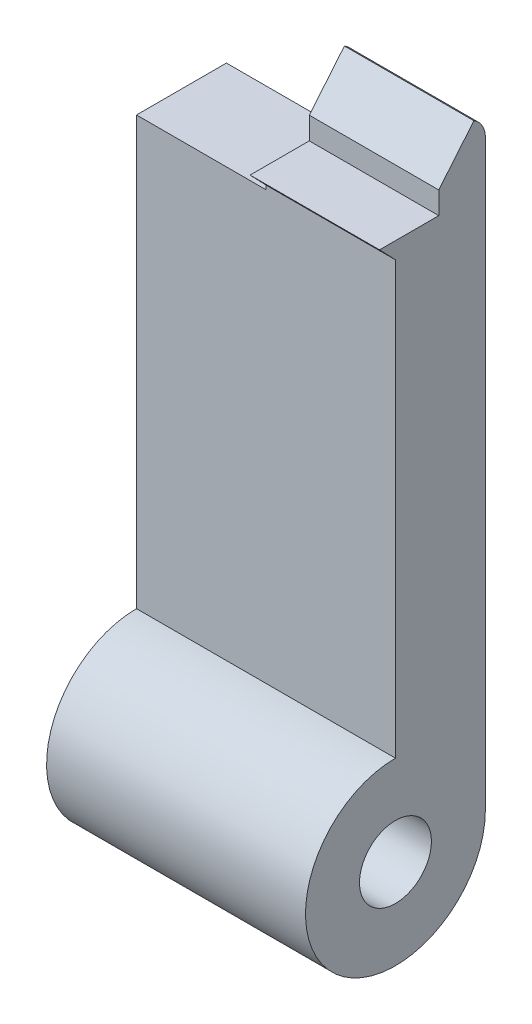
ISO-10303-21;
HEADER;
FILE_DESCRIPTION(('STEP AP214'),'2;1');
FILE_NAME('part.step','',(''),(''),'','','');
FILE_SCHEMA(('AUTOMOTIVE_DESIGN { 1 0 10303 214 1 1 1 1 }'));
ENDSEC;
DATA;
#1=APPLICATION_CONTEXT('core data for automotive mechanical design processes');
#2=APPLICATION_PROTOCOL_DEFINITION('international standard','automotive_design',2000,#1);
#3=PRODUCT_CONTEXT('',#1,'mechanical');
#4=PRODUCT('Part','Part','',(#3));
#5=PRODUCT_RELATED_PRODUCT_CATEGORY('part','',(#4));
#6=PRODUCT_DEFINITION_FORMATION('','',#4);
#7=PRODUCT_DEFINITION_CONTEXT('part definition',#1,'design');
#8=PRODUCT_DEFINITION('design','',#6,#7);
#9=PRODUCT_DEFINITION_SHAPE('','',#8);
#10=(LENGTH_UNIT() NAMED_UNIT(*) SI_UNIT(.MILLI.,.METRE.));
#11=(NAMED_UNIT(*) PLANE_ANGLE_UNIT() SI_UNIT($,.RADIAN.));
#12=(NAMED_UNIT(*) SI_UNIT($,.STERADIAN.) SOLID_ANGLE_UNIT());
#13=UNCERTAINTY_MEASURE_WITH_UNIT(LENGTH_MEASURE(1.E-05),#10,'distance_accuracy_value','');
#14=(GEOMETRIC_REPRESENTATION_CONTEXT(3) GLOBAL_UNCERTAINTY_ASSIGNED_CONTEXT((#13)) GLOBAL_UNIT_ASSIGNED_CONTEXT((#10,
#11,#12)) REPRESENTATION_CONTEXT('',''));
#15=CARTESIAN_POINT('',(0.,0.,0.));
#16=DIRECTION('',(0.,0.,1.));
#17=DIRECTION('',(1.,0.,0.));
#18=AXIS2_PLACEMENT_3D('',#15,#16,#17);
#19=CARTESIAN_POINT('',(9.144,0.,-1.52985296960418));
#20=DIRECTION('',(0.,0.,1.));
#21=DIRECTION('',(1.,0.,0.));
#22=AXIS2_PLACEMENT_3D('',#19,#20,#21);
#23=PLANE('',#22);
#24=DIRECTION('',(0.,1.,0.));
#25=VECTOR('',#24,1.);
#26=CARTESIAN_POINT('',(4.572,0.,-1.52985296960418));
#27=LINE('',#26,#25);
#28=CARTESIAN_POINT('',(4.572,19.000960284167,-1.52985296960418));
#29=VERTEX_POINT('',#28);
#30=CARTESIAN_POINT('',(4.572,19.7874801420835,-1.52985296960417));
#31=VERTEX_POINT('',#30);
#32=EDGE_CURVE('E186',#29,#31,#27,.T.);
#33=ORIENTED_EDGE('',*,*,#32,.F.);
#34=DIRECTION('',(-1.,0.,0.));
#35=VECTOR('',#34,1.);
#36=CARTESIAN_POINT('',(9.144,19.000960284167,-1.52985296960418));
#37=LINE('',#36,#35);
#38=CARTESIAN_POINT('',(9.144,19.000960284167,-1.52985296960418));
#39=VERTEX_POINT('',#38);
#40=EDGE_CURVE('E82',#39,#29,#37,.T.);
#41=ORIENTED_EDGE('',*,*,#40,.F.);
#42=DIRECTION('',(0.,1.,0.));
#43=VECTOR('',#42,1.);
#44=CARTESIAN_POINT('',(9.144,0.,-1.52985296960418));
#45=LINE('',#44,#43);
#46=CARTESIAN_POINT('',(9.144,19.7874801420835,-1.52985296960418));
#47=VERTEX_POINT('',#46);
#48=EDGE_CURVE('E143',#39,#47,#45,.T.);
#49=ORIENTED_EDGE('',*,*,#48,.T.);
#50=DIRECTION('',(-1.,0.,0.));
#51=VECTOR('',#50,1.);
#52=CARTESIAN_POINT('',(9.144,19.7874801420835,-1.52985296960418));
#53=LINE('',#52,#51);
#54=EDGE_CURVE('E131',#47,#31,#53,.T.);
#55=ORIENTED_EDGE('',*,*,#54,.T.);
#56=EDGE_LOOP('',(#33,#41,#49,#55));
#57=FACE_BOUND('',#56,.T.);
#58=ADVANCED_FACE('F34',(#57),#23,.T.);
#59=CARTESIAN_POINT('',(9.144,19.000960284167,0.));
#60=DIRECTION('',(0.,-1.,0.));
#61=DIRECTION('',(0.,0.,-1.));
#62=AXIS2_PLACEMENT_3D('',#59,#60,#61);
#63=PLANE('',#62);
#64=ORIENTED_EDGE('',*,*,#40,.T.);
#65=DIRECTION('',(0.,0.,1.));
#66=VECTOR('',#65,1.);
#67=CARTESIAN_POINT('',(4.572,19.000960284167,0.));
#68=LINE('',#67,#66);
#69=CARTESIAN_POINT('',(4.572,19.000960284167,0.561351088179941));
#70=VERTEX_POINT('',#69);
#71=EDGE_CURVE('E183',#29,#70,#68,.T.);
#72=ORIENTED_EDGE('',*,*,#71,.T.);
#73=DIRECTION('',(-1.,0.,0.));
#74=VECTOR('',#73,1.);
#75=CARTESIAN_POINT('',(9.144,19.000960284167,0.561351088179941));
#76=LINE('',#75,#74);
#77=CARTESIAN_POINT('',(9.144,19.000960284167,0.561351088179941));
#78=VERTEX_POINT('',#77);
#79=EDGE_CURVE('E153',#78,#70,#76,.T.);
#80=ORIENTED_EDGE('',*,*,#79,.F.);
#81=DIRECTION('',(0.,0.,1.));
#82=VECTOR('',#81,1.);
#83=CARTESIAN_POINT('',(9.144,19.000960284167,0.));
#84=LINE('',#83,#82);
#85=EDGE_CURVE('E173',#39,#78,#84,.T.);
#86=ORIENTED_EDGE('',*,*,#85,.F.);
#87=EDGE_LOOP('',(#64,#72,#80,#86));
#88=FACE_BOUND('',#87,.T.);
#89=ADVANCED_FACE('F227',(#88),#63,.F.);
#90=CARTESIAN_POINT('',(9.144,8.81269005290307,-9.19903154444387));
#91=DIRECTION('',(0.,-0.691780612318571,0.722107737404982));
#92=DIRECTION('',(0.,-0.722107737404982,-0.691780612318571));
#93=AXIS2_PLACEMENT_3D('',#90,#91,#92);
#94=PLANE('',#93);
#95=DIRECTION('',(0.,0.722107737404982,0.691780612318571));
#96=VECTOR('',#95,1.);
#97=CARTESIAN_POINT('',(4.572,8.81269005290307,-9.19903154444387));
#98=LINE('',#97,#96);
#99=CARTESIAN_POINT('',(4.572,18.415,0.));
#100=VERTEX_POINT('',#99);
#101=EDGE_CURVE('E180',#100,#70,#98,.T.);
#102=ORIENTED_EDGE('',*,*,#101,.F.);
#103=DIRECTION('',(-1.,0.,0.));
#104=VECTOR('',#103,1.);
#105=CARTESIAN_POINT('',(9.144,18.415,0.));
#106=LINE('',#105,#104);
#107=CARTESIAN_POINT('',(9.144,18.415,0.));
#108=VERTEX_POINT('',#107);
#109=EDGE_CURVE('E150',#108,#100,#106,.T.);
#110=ORIENTED_EDGE('',*,*,#109,.F.);
#111=DIRECTION('',(0.,0.722107737404982,0.691780612318571));
#112=VECTOR('',#111,1.);
#113=CARTESIAN_POINT('',(9.144,8.81269005290307,-9.19903154444387));
#114=LINE('',#113,#112);
#115=EDGE_CURVE('E170',#108,#78,#114,.T.);
#116=ORIENTED_EDGE('',*,*,#115,.T.);
#117=ORIENTED_EDGE('',*,*,#79,.T.);
#118=EDGE_LOOP('',(#102,#110,#116,#117));
#119=FACE_BOUND('',#118,.T.);
#120=ADVANCED_FACE('F217',(#119),#94,.T.);
#121=CARTESIAN_POINT('',(9.144,0.,0.));
#122=DIRECTION('',(0.,0.,1.));
#123=DIRECTION('',(1.,0.,0.));
#124=AXIS2_PLACEMENT_3D('',#121,#122,#123);
#125=PLANE('',#124);
#126=DIRECTION('',(0.,1.,0.));
#127=VECTOR('',#126,1.);
#128=CARTESIAN_POINT('',(4.572,0.,0.));
#129=LINE('',#128,#127);
#130=CARTESIAN_POINT('',(4.572,18.2729673551239,0.));
#131=VERTEX_POINT('',#130);
#132=EDGE_CURVE('E135',#131,#100,#129,.T.);
#133=ORIENTED_EDGE('',*,*,#132,.F.);
#134=DIRECTION('',(1.,0.,0.));
#135=VECTOR('',#134,1.);
#136=CARTESIAN_POINT('',(9.144,18.2729673551239,0.));
#137=LINE('',#136,#135);
#138=CARTESIAN_POINT('',(0.,18.2729673551239,0.));
#139=VERTEX_POINT('',#138);
#140=EDGE_CURVE('E192',#139,#131,#137,.T.);
#141=ORIENTED_EDGE('',*,*,#140,.F.);
#142=DIRECTION('',(0.,1.,0.));
#143=VECTOR('',#142,1.);
#144=CARTESIAN_POINT('',(0.,0.,0.));
#145=LINE('',#144,#143);
#146=CARTESIAN_POINT('',(0.,3.175,0.));
#147=VERTEX_POINT('',#146);
#148=EDGE_CURVE('E132',#147,#139,#145,.T.);
#149=ORIENTED_EDGE('',*,*,#148,.F.);
#150=DIRECTION('',(-1.,0.,0.));
#151=VECTOR('',#150,1.);
#152=CARTESIAN_POINT('',(9.144,3.175,0.));
#153=LINE('',#152,#151);
#154=CARTESIAN_POINT('',(9.144,3.175,0.));
#155=VERTEX_POINT('',#154);
#156=EDGE_CURVE('E148',#155,#147,#153,.T.);
#157=ORIENTED_EDGE('',*,*,#156,.F.);
#158=DIRECTION('',(0.,1.,0.));
#159=VECTOR('',#158,1.);
#160=CARTESIAN_POINT('',(9.144,0.,0.));
#161=LINE('',#160,#159);
#162=EDGE_CURVE('E166',#155,#108,#161,.T.);
#163=ORIENTED_EDGE('',*,*,#162,.T.);
#164=ORIENTED_EDGE('',*,*,#109,.T.);
#165=EDGE_LOOP('',(#133,#141,#149,#157,#163,#164));
#166=FACE_BOUND('',#165,.T.);
#167=ADVANCED_FACE('F219',(#166),#125,.T.);
#168=CARTESIAN_POINT('',(9.144,0.,0.));
#169=DIRECTION('',(-1.,0.,0.));
#170=DIRECTION('',(0.,0.,1.));
#171=AXIS2_PLACEMENT_3D('',#168,#169,#170);
#172=CYLINDRICAL_SURFACE('',#171,3.175);
#173=CARTESIAN_POINT('',(0.,0.,0.));
#174=DIRECTION('',(1.,0.,0.));
#175=DIRECTION('',(0.,0.,-1.));
#176=AXIS2_PLACEMENT_3D('',#173,#174,#175);
#177=CIRCLE('',#176,3.175);
#178=CARTESIAN_POINT('',(0.,0.,-3.175));
#179=VERTEX_POINT('',#178);
#180=EDGE_CURVE('E73',#147,#179,#177,.T.);
#181=ORIENTED_EDGE('',*,*,#180,.T.);
#182=DIRECTION('',(-1.,0.,0.));
#183=VECTOR('',#182,1.);
#184=CARTESIAN_POINT('',(9.144,0.,-3.175));
#185=LINE('',#184,#183);
#186=CARTESIAN_POINT('',(9.144,0.,-3.175));
#187=VERTEX_POINT('',#186);
#188=EDGE_CURVE('E119',#187,#179,#185,.T.);
#189=ORIENTED_EDGE('',*,*,#188,.F.);
#190=CARTESIAN_POINT('',(9.144,0.,0.));
#191=DIRECTION('',(1.,0.,0.));
#192=DIRECTION('',(0.,0.,-1.));
#193=AXIS2_PLACEMENT_3D('',#190,#191,#192);
#194=CIRCLE('',#193,3.175);
#195=EDGE_CURVE('E107',#155,#187,#194,.T.);
#196=ORIENTED_EDGE('',*,*,#195,.F.);
#197=ORIENTED_EDGE('',*,*,#156,.T.);
#198=EDGE_LOOP('',(#181,#189,#196,#197));
#199=FACE_BOUND('',#198,.T.);
#200=ADVANCED_FACE('F165',(#199),#172,.T.);
#201=CARTESIAN_POINT('',(9.144,0.,-3.175));
#202=DIRECTION('',(0.,0.,1.));
#203=DIRECTION('',(1.,0.,0.));
#204=AXIS2_PLACEMENT_3D('',#201,#202,#203);
#205=PLANE('',#204);
#206=DIRECTION('',(-1.,0.,0.));
#207=VECTOR('',#206,1.);
#208=CARTESIAN_POINT('',(4.572,18.2729673551239,-3.175));
#209=LINE('',#208,#207);
#210=CARTESIAN_POINT('',(4.572,18.2729673551239,-3.175));
#211=VERTEX_POINT('',#210);
#212=CARTESIAN_POINT('',(0.,18.2729673551239,-3.175));
#213=VERTEX_POINT('',#212);
#214=EDGE_CURVE('E48',#211,#213,#209,.T.);
#215=ORIENTED_EDGE('',*,*,#214,.F.);
#216=DIRECTION('',(0.,-1.,0.));
#217=VECTOR('',#216,1.);
#218=CARTESIAN_POINT('',(4.572,21.2824031479205,-3.175));
#219=LINE('',#218,#217);
#220=CARTESIAN_POINT('',(4.572,20.574,-3.175));
#221=VERTEX_POINT('',#220);
#222=EDGE_CURVE('E116',#221,#211,#219,.T.);
#223=ORIENTED_EDGE('',*,*,#222,.F.);
#224=DIRECTION('',(-1.,0.,0.));
#225=VECTOR('',#224,1.);
#226=CARTESIAN_POINT('',(9.144,20.574,-3.175));
#227=LINE('',#226,#225);
#228=CARTESIAN_POINT('',(9.144,20.574,-3.175));
#229=VERTEX_POINT('',#228);
#230=EDGE_CURVE('E112',#229,#221,#227,.T.);
#231=ORIENTED_EDGE('',*,*,#230,.F.);
#232=DIRECTION('',(0.,1.,0.));
#233=VECTOR('',#232,1.);
#234=CARTESIAN_POINT('',(9.144,0.,-3.175));
#235=LINE('',#234,#233);
#236=EDGE_CURVE('E99',#187,#229,#235,.T.);
#237=ORIENTED_EDGE('',*,*,#236,.F.);
#238=ORIENTED_EDGE('',*,*,#188,.T.);
#239=DIRECTION('',(0.,1.,0.));
#240=VECTOR('',#239,1.);
#241=CARTESIAN_POINT('',(0.,0.,-3.175));
#242=LINE('',#241,#240);
#243=EDGE_CURVE('E137',#179,#213,#242,.T.);
#244=ORIENTED_EDGE('',*,*,#243,.T.);
#245=EDGE_LOOP('',(#215,#223,#231,#237,#238,#244));
#246=FACE_BOUND('',#245,.T.);
#247=ADVANCED_FACE('F113',(#246),#205,.F.);
#248=CARTESIAN_POINT('',(9.144,20.574,-2.35242648480209));
#249=DIRECTION('',(-1.,0.,0.));
#250=DIRECTION('',(0.,0.,1.));
#251=AXIS2_PLACEMENT_3D('',#248,#249,#250);
#252=CYLINDRICAL_SURFACE('',#251,0.822573515197912);
#253=CARTESIAN_POINT('',(4.572,20.574,-2.35242648480209));
#254=DIRECTION('',(1.,0.,0.));
#255=DIRECTION('',(0.,0.,-1.));
#256=AXIS2_PLACEMENT_3D('',#253,#254,#255);
#257=CIRCLE('',#256,0.822573515197912);
#258=CARTESIAN_POINT('',(4.572,21.2824031479205,-2.77050801742632));
#259=VERTEX_POINT('',#258);
#260=EDGE_CURVE('E189',#259,#221,#257,.F.);
#261=ORIENTED_EDGE('',*,*,#260,.F.);
#262=DIRECTION('',(-1.,0.,0.));
#263=VECTOR('',#262,1.);
#264=CARTESIAN_POINT('',(9.144,21.2824031479205,-2.77050801742632));
#265=LINE('',#264,#263);
#266=CARTESIAN_POINT('',(9.144,21.2824031479205,-2.77050801742632));
#267=VERTEX_POINT('',#266);
#268=EDGE_CURVE('E120',#267,#259,#265,.T.);
#269=ORIENTED_EDGE('',*,*,#268,.F.);
#270=CARTESIAN_POINT('',(9.144,20.574,-2.35242648480209));
#271=DIRECTION('',(1.,0.,0.));
#272=DIRECTION('',(0.,0.,-1.));
#273=AXIS2_PLACEMENT_3D('',#270,#271,#272);
#274=CIRCLE('',#273,0.822573515197912);
#275=EDGE_CURVE('E104',#267,#229,#274,.F.);
#276=ORIENTED_EDGE('',*,*,#275,.T.);
#277=ORIENTED_EDGE('',*,*,#230,.T.);
#278=EDGE_LOOP('',(#261,#269,#276,#277));
#279=FACE_BOUND('',#278,.T.);
#280=ADVANCED_FACE('F122',(#279),#252,.T.);
#281=CARTESIAN_POINT('',(9.144,7.31845393063113,8.81834573378265));
#282=DIRECTION('',(0.,-0.638629481227086,-0.769514383041424));
#283=DIRECTION('',(0.,0.769514383041424,-0.638629481227086));
#284=AXIS2_PLACEMENT_3D('',#281,#282,#283);
#285=PLANE('',#284);
#286=ORIENTED_EDGE('',*,*,#268,.T.);
#287=DIRECTION('',(0.,-0.769514383041424,0.638629481227086));
#288=VECTOR('',#287,1.);
#289=CARTESIAN_POINT('',(4.572,7.31845393063113,8.81834573378265));
#290=LINE('',#289,#288);
#291=EDGE_CURVE('E11',#259,#31,#290,.T.);
#292=ORIENTED_EDGE('',*,*,#291,.T.);
#293=ORIENTED_EDGE('',*,*,#54,.F.);
#294=DIRECTION('',(0.,-0.769514383041424,0.638629481227086));
#295=VECTOR('',#294,1.);
#296=CARTESIAN_POINT('',(9.144,7.31845393063113,8.81834573378265));
#297=LINE('',#296,#295);
#298=EDGE_CURVE('E57',#267,#47,#297,.T.);
#299=ORIENTED_EDGE('',*,*,#298,.F.);
#300=EDGE_LOOP('',(#286,#292,#293,#299));
#301=FACE_BOUND('',#300,.T.);
#302=ADVANCED_FACE('F235',(#301),#285,.F.);
#303=CARTESIAN_POINT('',(9.144,0.,0.));
#304=DIRECTION('',(-1.,0.,0.));
#305=DIRECTION('',(0.,0.,1.));
#306=AXIS2_PLACEMENT_3D('',#303,#304,#305);
#307=CYLINDRICAL_SURFACE('',#306,1.27);
#308=CARTESIAN_POINT('',(9.144,0.,0.));
#309=DIRECTION('',(1.,0.,0.));
#310=DIRECTION('',(0.,0.,-1.));
#311=AXIS2_PLACEMENT_3D('',#308,#309,#310);
#312=CIRCLE('',#311,1.27);
#313=CARTESIAN_POINT('',(9.144,0.,-1.27));
#314=VERTEX_POINT('',#313);
#315=EDGE_CURVE('E125',#314,#314,#312,.T.);
#316=ORIENTED_EDGE('',*,*,#315,.T.);
#317=EDGE_LOOP('',(#316));
#318=FACE_BOUND('',#317,.T.);
#319=CARTESIAN_POINT('',(0.,0.,0.));
#320=DIRECTION('',(1.,0.,0.));
#321=DIRECTION('',(0.,0.,-1.));
#322=AXIS2_PLACEMENT_3D('',#319,#320,#321);
#323=CIRCLE('',#322,1.27);
#324=CARTESIAN_POINT('',(0.,0.,-1.27));
#325=VERTEX_POINT('',#324);
#326=EDGE_CURVE('E140',#325,#325,#323,.T.);
#327=ORIENTED_EDGE('',*,*,#326,.F.);
#328=EDGE_LOOP('',(#327));
#329=FACE_BOUND('',#328,.T.);
#330=ADVANCED_FACE('F237',(#318,#329),#307,.F.);
#331=CARTESIAN_POINT('',(9.144,0.,0.));
#332=DIRECTION('',(1.,0.,0.));
#333=DIRECTION('',(0.,0.,-1.));
#334=AXIS2_PLACEMENT_3D('',#331,#332,#333);
#335=PLANE('',#334);
#336=ORIENTED_EDGE('',*,*,#48,.F.);
#337=ORIENTED_EDGE('',*,*,#85,.T.);
#338=ORIENTED_EDGE('',*,*,#115,.F.);
#339=ORIENTED_EDGE('',*,*,#162,.F.);
#340=ORIENTED_EDGE('',*,*,#195,.T.);
#341=ORIENTED_EDGE('',*,*,#236,.T.);
#342=ORIENTED_EDGE('',*,*,#275,.F.);
#343=ORIENTED_EDGE('',*,*,#298,.T.);
#344=EDGE_LOOP('',(#336,#337,#338,#339,#340,#341,#342,#343));
#345=FACE_BOUND('',#344,.T.);
#346=ORIENTED_EDGE('',*,*,#315,.F.);
#347=EDGE_LOOP('',(#346));
#348=FACE_BOUND('',#347,.T.);
#349=ADVANCED_FACE('F101',(#345,#348),#335,.T.);
#350=CARTESIAN_POINT('',(0.,0.,0.));
#351=DIRECTION('',(1.,0.,0.));
#352=DIRECTION('',(0.,0.,-1.));
#353=AXIS2_PLACEMENT_3D('',#350,#351,#352);
#354=PLANE('',#353);
#355=ORIENTED_EDGE('',*,*,#148,.T.);
#356=DIRECTION('',(0.,0.,-1.));
#357=VECTOR('',#356,1.);
#358=CARTESIAN_POINT('',(0.,18.2729673551239,0.));
#359=LINE('',#358,#357);
#360=EDGE_CURVE('E41',#139,#213,#359,.T.);
#361=ORIENTED_EDGE('',*,*,#360,.T.);
#362=ORIENTED_EDGE('',*,*,#243,.F.);
#363=ORIENTED_EDGE('',*,*,#180,.F.);
#364=EDGE_LOOP('',(#355,#361,#362,#363));
#365=FACE_BOUND('',#364,.T.);
#366=ORIENTED_EDGE('',*,*,#326,.T.);
#367=EDGE_LOOP('',(#366));
#368=FACE_BOUND('',#367,.T.);
#369=ADVANCED_FACE('F158',(#365,#368),#354,.F.);
#370=CARTESIAN_POINT('',(4.572,21.2824031479205,3.175));
#371=DIRECTION('',(1.,0.,0.));
#372=DIRECTION('',(0.,0.,-1.));
#373=AXIS2_PLACEMENT_3D('',#370,#371,#372);
#374=PLANE('',#373);
#375=ORIENTED_EDGE('',*,*,#132,.T.);
#376=ORIENTED_EDGE('',*,*,#101,.T.);
#377=ORIENTED_EDGE('',*,*,#71,.F.);
#378=ORIENTED_EDGE('',*,*,#32,.T.);
#379=ORIENTED_EDGE('',*,*,#291,.F.);
#380=ORIENTED_EDGE('',*,*,#260,.T.);
#381=ORIENTED_EDGE('',*,*,#222,.T.);
#382=DIRECTION('',(0.,0.,-1.));
#383=VECTOR('',#382,1.);
#384=CARTESIAN_POINT('',(4.572,18.2729673551239,3.175));
#385=LINE('',#384,#383);
#386=EDGE_CURVE('E194',#131,#211,#385,.T.);
#387=ORIENTED_EDGE('',*,*,#386,.F.);
#388=EDGE_LOOP('',(#375,#376,#377,#378,#379,#380,#381,#387));
#389=FACE_BOUND('',#388,.T.);
#390=ADVANCED_FACE('F199',(#389),#374,.F.);
#391=CARTESIAN_POINT('',(4.572,18.2729673551239,3.175));
#392=DIRECTION('',(0.,-1.,0.));
#393=DIRECTION('',(0.,0.,-1.));
#394=AXIS2_PLACEMENT_3D('',#391,#392,#393);
#395=PLANE('',#394);
#396=ORIENTED_EDGE('',*,*,#140,.T.);
#397=ORIENTED_EDGE('',*,*,#386,.T.);
#398=ORIENTED_EDGE('',*,*,#214,.T.);
#399=ORIENTED_EDGE('',*,*,#360,.F.);
#400=EDGE_LOOP('',(#396,#397,#398,#399));
#401=FACE_BOUND('',#400,.T.);
#402=ADVANCED_FACE('F280',(#401),#395,.F.);
#403=CLOSED_SHELL('',(#58,#89,#120,#167,#200,#247,#280,#302,#330,#349,#369,#390,#402));
#404=MANIFOLD_SOLID_BREP('B2',#403);
#405=ADVANCED_BREP_SHAPE_REPRESENTATION('',(#18,#404),#14);
#406=SHAPE_DEFINITION_REPRESENTATION(#9,#405);
ENDSEC;
END-ISO-10303-21;
